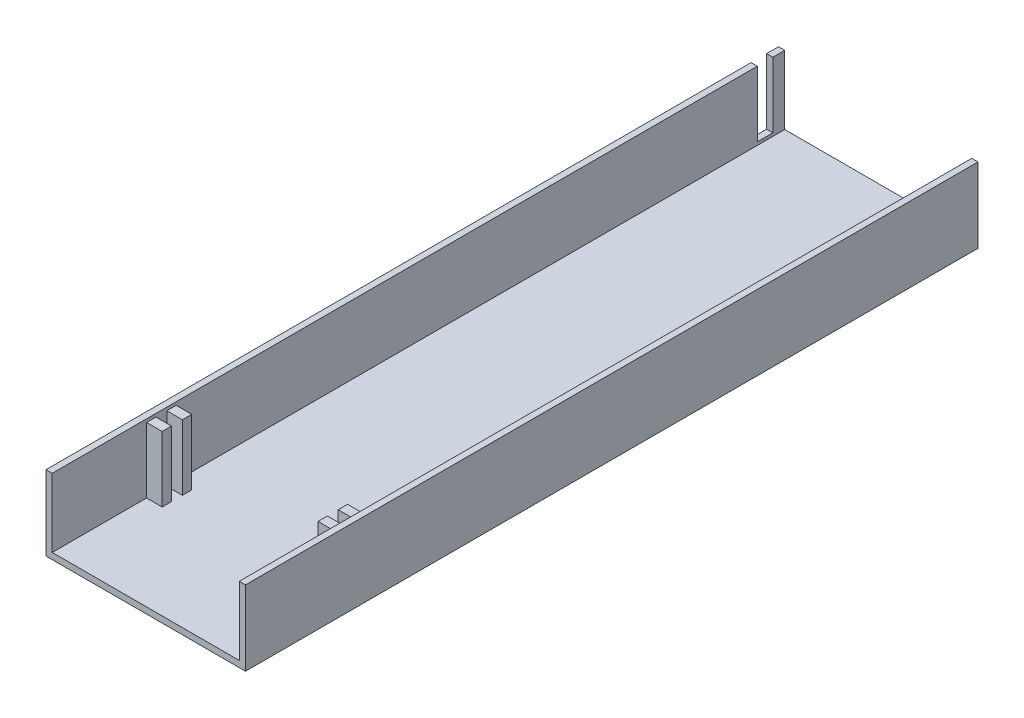
ISO-10303-21;
HEADER;
FILE_DESCRIPTION(('STEP AP214'),'2;1');
FILE_NAME('part.step','',(''),(''),'','','');
FILE_SCHEMA(('AUTOMOTIVE_DESIGN { 1 0 10303 214 1 1 1 1 }'));
ENDSEC;
DATA;
#1=APPLICATION_CONTEXT('core data for automotive mechanical design processes');
#2=APPLICATION_PROTOCOL_DEFINITION('international standard','automotive_design',2000,#1);
#3=PRODUCT_CONTEXT('',#1,'mechanical');
#4=PRODUCT('Part','Part','',(#3));
#5=PRODUCT_RELATED_PRODUCT_CATEGORY('part','',(#4));
#6=PRODUCT_DEFINITION_FORMATION('','',#4);
#7=PRODUCT_DEFINITION_CONTEXT('part definition',#1,'design');
#8=PRODUCT_DEFINITION('design','',#6,#7);
#9=PRODUCT_DEFINITION_SHAPE('','',#8);
#10=(LENGTH_UNIT() NAMED_UNIT(*) SI_UNIT(.MILLI.,.METRE.));
#11=(NAMED_UNIT(*) PLANE_ANGLE_UNIT() SI_UNIT($,.RADIAN.));
#12=(NAMED_UNIT(*) SI_UNIT($,.STERADIAN.) SOLID_ANGLE_UNIT());
#13=UNCERTAINTY_MEASURE_WITH_UNIT(LENGTH_MEASURE(1.E-05),#10,'distance_accuracy_value','');
#14=(GEOMETRIC_REPRESENTATION_CONTEXT(3) GLOBAL_UNCERTAINTY_ASSIGNED_CONTEXT((#13)) GLOBAL_UNIT_ASSIGNED_CONTEXT((#10,
#11,#12)) REPRESENTATION_CONTEXT('',''));
#15=CARTESIAN_POINT('',(0.,0.,0.));
#16=DIRECTION('',(0.,0.,1.));
#17=DIRECTION('',(1.,0.,0.));
#18=AXIS2_PLACEMENT_3D('',#15,#16,#17);
#19=CARTESIAN_POINT('',(-30.,12.,35.));
#20=DIRECTION('',(0.,-1.,0.));
#21=DIRECTION('',(0.,0.,-1.));
#22=AXIS2_PLACEMENT_3D('',#19,#20,#21);
#23=PLANE('',#22);
#24=DIRECTION('',(0.,0.,-1.));
#25=VECTOR('',#24,1.);
#26=CARTESIAN_POINT('',(-30.,12.,35.));
#27=LINE('',#26,#25);
#28=CARTESIAN_POINT('',(-30.,12.,35.));
#29=VERTEX_POINT('',#28);
#30=CARTESIAN_POINT('',(-30.,12.,-191.2));
#31=VERTEX_POINT('',#30);
#32=EDGE_CURVE('E11',#29,#31,#27,.T.);
#33=ORIENTED_EDGE('',*,*,#32,.T.);
#34=DIRECTION('',(-1.,0.,0.));
#35=VECTOR('',#34,1.);
#36=CARTESIAN_POINT('',(-22.,12.,-191.2));
#37=LINE('',#36,#35);
#38=CARTESIAN_POINT('',(-32.,12.,-191.2));
#39=VERTEX_POINT('',#38);
#40=EDGE_CURVE('E243',#31,#39,#37,.T.);
#41=ORIENTED_EDGE('',*,*,#40,.T.);
#42=DIRECTION('',(0.,0.,-1.));
#43=VECTOR('',#42,1.);
#44=CARTESIAN_POINT('',(-32.,12.,35.));
#45=LINE('',#44,#43);
#46=CARTESIAN_POINT('',(-32.,12.,35.));
#47=VERTEX_POINT('',#46);
#48=EDGE_CURVE('E426',#47,#39,#45,.T.);
#49=ORIENTED_EDGE('',*,*,#48,.F.);
#50=DIRECTION('',(-1.,0.,0.));
#51=VECTOR('',#50,1.);
#52=CARTESIAN_POINT('',(-30.,12.,35.));
#53=LINE('',#52,#51);
#54=EDGE_CURVE('E394',#29,#47,#53,.T.);
#55=ORIENTED_EDGE('',*,*,#54,.F.);
#56=EDGE_LOOP('',(#33,#41,#49,#55));
#57=FACE_BOUND('',#56,.T.);
#58=ADVANCED_FACE('F33',(#57),#23,.F.);
#59=CARTESIAN_POINT('',(30.,-9.99999999999999,35.));
#60=DIRECTION('',(0.,-1.,0.));
#61=DIRECTION('',(1.,0.,0.));
#62=AXIS2_PLACEMENT_3D('',#59,#60,#61);
#63=PLANE('',#62);
#64=DIRECTION('',(1.,0.,0.));
#65=VECTOR('',#64,1.);
#66=CARTESIAN_POINT('',(-25.,-10.,4.75));
#67=LINE('',#66,#65);
#68=CARTESIAN_POINT('',(-30.,-10.,4.75));
#69=VERTEX_POINT('',#68);
#70=CARTESIAN_POINT('',(-25.,-10.,4.75));
#71=VERTEX_POINT('',#70);
#72=EDGE_CURVE('E252',#69,#71,#67,.T.);
#73=ORIENTED_EDGE('',*,*,#72,.F.);
#74=DIRECTION('',(0.,0.,-1.));
#75=VECTOR('',#74,1.);
#76=CARTESIAN_POINT('',(-30.,-10.,35.));
#77=LINE('',#76,#75);
#78=CARTESIAN_POINT('',(-30.,-10.,35.));
#79=VERTEX_POINT('',#78);
#80=EDGE_CURVE('E409',#79,#69,#77,.T.);
#81=ORIENTED_EDGE('',*,*,#80,.F.);
#82=DIRECTION('',(-1.,0.,0.));
#83=VECTOR('',#82,1.);
#84=CARTESIAN_POINT('',(30.,-9.99999999999999,35.));
#85=LINE('',#84,#83);
#86=CARTESIAN_POINT('',(30.,-9.99999999999999,35.));
#87=VERTEX_POINT('',#86);
#88=EDGE_CURVE('E406',#87,#79,#85,.T.);
#89=ORIENTED_EDGE('',*,*,#88,.F.);
#90=DIRECTION('',(0.,0.,-1.));
#91=VECTOR('',#90,1.);
#92=CARTESIAN_POINT('',(30.,-9.99999999999999,35.));
#93=LINE('',#92,#91);
#94=CARTESIAN_POINT('',(30.,-9.99999999999999,4.75));
#95=VERTEX_POINT('',#94);
#96=EDGE_CURVE('E414',#87,#95,#93,.T.);
#97=ORIENTED_EDGE('',*,*,#96,.T.);
#98=DIRECTION('',(1.,0.,0.));
#99=VECTOR('',#98,1.);
#100=CARTESIAN_POINT('',(25.,-9.99999999999999,4.75));
#101=LINE('',#100,#99);
#102=CARTESIAN_POINT('',(25.,-9.99999999999999,4.75));
#103=VERTEX_POINT('',#102);
#104=EDGE_CURVE('E314',#103,#95,#101,.T.);
#105=ORIENTED_EDGE('',*,*,#104,.F.);
#106=DIRECTION('',(0.,0.,1.));
#107=VECTOR('',#106,1.);
#108=CARTESIAN_POINT('',(25.,-9.99999999999999,1.75));
#109=LINE('',#108,#107);
#110=CARTESIAN_POINT('',(25.,-9.99999999999999,1.75));
#111=VERTEX_POINT('',#110);
#112=EDGE_CURVE('E324',#111,#103,#109,.T.);
#113=ORIENTED_EDGE('',*,*,#112,.F.);
#114=DIRECTION('',(-1.,0.,0.));
#115=VECTOR('',#114,1.);
#116=CARTESIAN_POINT('',(30.,-9.99999999999999,1.75));
#117=LINE('',#116,#115);
#118=CARTESIAN_POINT('',(30.,-9.99999999999999,1.75));
#119=VERTEX_POINT('',#118);
#120=EDGE_CURVE('E309',#119,#111,#117,.T.);
#121=ORIENTED_EDGE('',*,*,#120,.F.);
#122=CARTESIAN_POINT('',(30.,-9.99999999999999,-1.75));
#123=VERTEX_POINT('',#122);
#124=EDGE_CURVE('E418',#119,#123,#93,.T.);
#125=ORIENTED_EDGE('',*,*,#124,.T.);
#126=DIRECTION('',(1.,0.,0.));
#127=VECTOR('',#126,1.);
#128=CARTESIAN_POINT('',(30.,-9.99999999999999,-1.75));
#129=LINE('',#128,#127);
#130=CARTESIAN_POINT('',(25.,-9.99999999999999,-1.75));
#131=VERTEX_POINT('',#130);
#132=EDGE_CURVE('E284',#131,#123,#129,.T.);
#133=ORIENTED_EDGE('',*,*,#132,.F.);
#134=DIRECTION('',(0.,0.,1.));
#135=VECTOR('',#134,1.);
#136=CARTESIAN_POINT('',(25.,-9.99999999999999,-1.75));
#137=LINE('',#136,#135);
#138=CARTESIAN_POINT('',(25.,-9.99999999999999,-4.75));
#139=VERTEX_POINT('',#138);
#140=EDGE_CURVE('E294',#139,#131,#137,.T.);
#141=ORIENTED_EDGE('',*,*,#140,.F.);
#142=DIRECTION('',(-1.,0.,0.));
#143=VECTOR('',#142,1.);
#144=CARTESIAN_POINT('',(25.,-9.99999999999999,-4.75));
#145=LINE('',#144,#143);
#146=CARTESIAN_POINT('',(30.,-9.99999999999999,-4.75));
#147=VERTEX_POINT('',#146);
#148=EDGE_CURVE('E279',#147,#139,#145,.T.);
#149=ORIENTED_EDGE('',*,*,#148,.F.);
#150=CARTESIAN_POINT('',(30.,-9.99999999999999,-200.));
#151=VERTEX_POINT('',#150);
#152=EDGE_CURVE('E412',#147,#151,#93,.T.);
#153=ORIENTED_EDGE('',*,*,#152,.T.);
#154=DIRECTION('',(1.,0.,0.));
#155=VECTOR('',#154,1.);
#156=CARTESIAN_POINT('',(-30.,-10.,-200.));
#157=LINE('',#156,#155);
#158=CARTESIAN_POINT('',(-30.,-10.,-200.));
#159=VERTEX_POINT('',#158);
#160=EDGE_CURVE('E368',#159,#151,#157,.T.);
#161=ORIENTED_EDGE('',*,*,#160,.F.);
#162=CARTESIAN_POINT('',(-30.,-10.,-4.75));
#163=VERTEX_POINT('',#162);
#164=EDGE_CURVE('E408',#163,#159,#77,.T.);
#165=ORIENTED_EDGE('',*,*,#164,.F.);
#166=DIRECTION('',(-1.,0.,0.));
#167=VECTOR('',#166,1.);
#168=CARTESIAN_POINT('',(-25.,-10.,-4.75));
#169=LINE('',#168,#167);
#170=CARTESIAN_POINT('',(-25.,-10.,-4.75));
#171=VERTEX_POINT('',#170);
#172=EDGE_CURVE('E341',#171,#163,#169,.T.);
#173=ORIENTED_EDGE('',*,*,#172,.F.);
#174=DIRECTION('',(0.,0.,-1.));
#175=VECTOR('',#174,1.);
#176=CARTESIAN_POINT('',(-25.,-10.,-1.75));
#177=LINE('',#176,#175);
#178=CARTESIAN_POINT('',(-25.,-10.,-1.75));
#179=VERTEX_POINT('',#178);
#180=EDGE_CURVE('E352',#179,#171,#177,.T.);
#181=ORIENTED_EDGE('',*,*,#180,.F.);
#182=DIRECTION('',(1.,0.,0.));
#183=VECTOR('',#182,1.);
#184=CARTESIAN_POINT('',(-30.,-10.,-1.75));
#185=LINE('',#184,#183);
#186=CARTESIAN_POINT('',(-30.,-10.,-1.75));
#187=VERTEX_POINT('',#186);
#188=EDGE_CURVE('E336',#187,#179,#185,.T.);
#189=ORIENTED_EDGE('',*,*,#188,.F.);
#190=CARTESIAN_POINT('',(-30.,-10.,1.75));
#191=VERTEX_POINT('',#190);
#192=EDGE_CURVE('E413',#191,#187,#77,.T.);
#193=ORIENTED_EDGE('',*,*,#192,.F.);
#194=DIRECTION('',(-1.,0.,0.));
#195=VECTOR('',#194,1.);
#196=CARTESIAN_POINT('',(-30.,-10.,1.75));
#197=LINE('',#196,#195);
#198=CARTESIAN_POINT('',(-25.,-10.,1.75));
#199=VERTEX_POINT('',#198);
#200=EDGE_CURVE('E257',#199,#191,#197,.T.);
#201=ORIENTED_EDGE('',*,*,#200,.F.);
#202=DIRECTION('',(0.,0.,-1.));
#203=VECTOR('',#202,1.);
#204=CARTESIAN_POINT('',(-25.,-10.,1.75));
#205=LINE('',#204,#203);
#206=EDGE_CURVE('E56',#71,#199,#205,.T.);
#207=ORIENTED_EDGE('',*,*,#206,.F.);
#208=EDGE_LOOP('',(#73,#81,#89,#97,#105,#113,#121,#125,#133,#141,#149,#153,#161,#165,#173,#181,
#189,#193,#201,#207));
#209=FACE_BOUND('',#208,.T.);
#210=ADVANCED_FACE('F441',(#209),#63,.F.);
#211=CARTESIAN_POINT('',(-30.,12.,35.));
#212=DIRECTION('',(-1.,0.,0.));
#213=DIRECTION('',(0.,-1.,0.));
#214=AXIS2_PLACEMENT_3D('',#211,#212,#213);
#215=PLANE('',#214);
#216=DIRECTION('',(0.,0.,1.));
#217=VECTOR('',#216,1.);
#218=CARTESIAN_POINT('',(-30.,-9.,35.));
#219=LINE('',#218,#217);
#220=CARTESIAN_POINT('',(-30.,-9.,-196.2));
#221=VERTEX_POINT('',#220);
#222=CARTESIAN_POINT('',(-30.,-9.,-191.2));
#223=VERTEX_POINT('',#222);
#224=EDGE_CURVE('E226',#221,#223,#219,.T.);
#225=ORIENTED_EDGE('',*,*,#224,.T.);
#226=DIRECTION('',(0.,1.,0.));
#227=VECTOR('',#226,1.);
#228=CARTESIAN_POINT('',(-30.,12.,-191.2));
#229=LINE('',#228,#227);
#230=EDGE_CURVE('E249',#223,#31,#229,.T.);
#231=ORIENTED_EDGE('',*,*,#230,.T.);
#232=ORIENTED_EDGE('',*,*,#32,.F.);
#233=DIRECTION('',(0.,1.,0.));
#234=VECTOR('',#233,1.);
#235=CARTESIAN_POINT('',(-30.,-10.,35.));
#236=LINE('',#235,#234);
#237=EDGE_CURVE('E392',#79,#29,#236,.T.);
#238=ORIENTED_EDGE('',*,*,#237,.F.);
#239=ORIENTED_EDGE('',*,*,#80,.T.);
#240=DIRECTION('',(0.,-1.,0.));
#241=VECTOR('',#240,1.);
#242=CARTESIAN_POINT('',(-30.,11.,4.75));
#243=LINE('',#242,#241);
#244=CARTESIAN_POINT('',(-30.,11.,4.75));
#245=VERTEX_POINT('',#244);
#246=EDGE_CURVE('E276',#245,#69,#243,.T.);
#247=ORIENTED_EDGE('',*,*,#246,.F.);
#248=DIRECTION('',(0.,0.,1.));
#249=VECTOR('',#248,1.);
#250=CARTESIAN_POINT('',(-30.,11.,4.75));
#251=LINE('',#250,#249);
#252=CARTESIAN_POINT('',(-30.,11.,1.75));
#253=VERTEX_POINT('',#252);
#254=EDGE_CURVE('E253',#253,#245,#251,.T.);
#255=ORIENTED_EDGE('',*,*,#254,.F.);
#256=DIRECTION('',(0.,-1.,0.));
#257=VECTOR('',#256,1.);
#258=CARTESIAN_POINT('',(-30.,11.,1.75));
#259=LINE('',#258,#257);
#260=EDGE_CURVE('E264',#253,#191,#259,.T.);
#261=ORIENTED_EDGE('',*,*,#260,.T.);
#262=ORIENTED_EDGE('',*,*,#192,.T.);
#263=DIRECTION('',(0.,-1.,0.));
#264=VECTOR('',#263,1.);
#265=CARTESIAN_POINT('',(-30.,11.,-1.75));
#266=LINE('',#265,#264);
#267=CARTESIAN_POINT('',(-30.,11.,-1.75));
#268=VERTEX_POINT('',#267);
#269=EDGE_CURVE('E349',#268,#187,#266,.T.);
#270=ORIENTED_EDGE('',*,*,#269,.F.);
#271=DIRECTION('',(0.,0.,1.));
#272=VECTOR('',#271,1.);
#273=CARTESIAN_POINT('',(-30.,11.,-4.75));
#274=LINE('',#273,#272);
#275=CARTESIAN_POINT('',(-30.,11.,-4.75));
#276=VERTEX_POINT('',#275);
#277=EDGE_CURVE('E346',#276,#268,#274,.T.);
#278=ORIENTED_EDGE('',*,*,#277,.F.);
#279=DIRECTION('',(0.,-1.,0.));
#280=VECTOR('',#279,1.);
#281=CARTESIAN_POINT('',(-30.,11.,-4.75));
#282=LINE('',#281,#280);
#283=EDGE_CURVE('E359',#276,#163,#282,.T.);
#284=ORIENTED_EDGE('',*,*,#283,.T.);
#285=ORIENTED_EDGE('',*,*,#164,.T.);
#286=DIRECTION('',(0.,-1.,0.));
#287=VECTOR('',#286,1.);
#288=CARTESIAN_POINT('',(-30.,12.,-200.));
#289=LINE('',#288,#287);
#290=CARTESIAN_POINT('',(-30.,12.,-200.));
#291=VERTEX_POINT('',#290);
#292=EDGE_CURVE('E389',#291,#159,#289,.T.);
#293=ORIENTED_EDGE('',*,*,#292,.F.);
#294=CARTESIAN_POINT('',(-30.,12.,-196.2));
#295=VERTEX_POINT('',#294);
#296=EDGE_CURVE('E41',#295,#291,#27,.T.);
#297=ORIENTED_EDGE('',*,*,#296,.F.);
#298=DIRECTION('',(0.,-1.,0.));
#299=VECTOR('',#298,1.);
#300=CARTESIAN_POINT('',(-30.,12.,-196.2));
#301=LINE('',#300,#299);
#302=EDGE_CURVE('E242',#295,#221,#301,.T.);
#303=ORIENTED_EDGE('',*,*,#302,.T.);
#304=EDGE_LOOP('',(#225,#231,#232,#238,#239,#247,#255,#261,#262,#270,#278,#284,#285,#293,#297,#303));
#305=FACE_BOUND('',#304,.T.);
#306=ADVANCED_FACE('F35',(#305),#215,.F.);
#307=CARTESIAN_POINT('',(30.,-9.99999999999999,35.));
#308=DIRECTION('',(1.,0.,0.));
#309=DIRECTION('',(0.,0.,-1.));
#310=AXIS2_PLACEMENT_3D('',#307,#308,#309);
#311=PLANE('',#310);
#312=DIRECTION('',(0.,-1.,0.));
#313=VECTOR('',#312,1.);
#314=CARTESIAN_POINT('',(30.,11.,-4.75));
#315=LINE('',#314,#313);
#316=CARTESIAN_POINT('',(30.,11.,-4.75));
#317=VERTEX_POINT('',#316);
#318=EDGE_CURVE('E306',#317,#147,#315,.T.);
#319=ORIENTED_EDGE('',*,*,#318,.F.);
#320=DIRECTION('',(0.,0.,-1.));
#321=VECTOR('',#320,1.);
#322=CARTESIAN_POINT('',(30.,11.,-4.75));
#323=LINE('',#322,#321);
#324=CARTESIAN_POINT('',(30.,11.,-1.75));
#325=VERTEX_POINT('',#324);
#326=EDGE_CURVE('E280',#325,#317,#323,.T.);
#327=ORIENTED_EDGE('',*,*,#326,.F.);
#328=DIRECTION('',(0.,-1.,0.));
#329=VECTOR('',#328,1.);
#330=CARTESIAN_POINT('',(30.,11.,-1.75));
#331=LINE('',#330,#329);
#332=EDGE_CURVE('E291',#325,#123,#331,.T.);
#333=ORIENTED_EDGE('',*,*,#332,.T.);
#334=ORIENTED_EDGE('',*,*,#124,.F.);
#335=DIRECTION('',(0.,-1.,0.));
#336=VECTOR('',#335,1.);
#337=CARTESIAN_POINT('',(30.,11.,1.75));
#338=LINE('',#337,#336);
#339=CARTESIAN_POINT('',(30.,11.,1.75));
#340=VERTEX_POINT('',#339);
#341=EDGE_CURVE('E321',#340,#119,#338,.T.);
#342=ORIENTED_EDGE('',*,*,#341,.F.);
#343=DIRECTION('',(0.,0.,-1.));
#344=VECTOR('',#343,1.);
#345=CARTESIAN_POINT('',(30.,11.,4.75));
#346=LINE('',#345,#344);
#347=CARTESIAN_POINT('',(30.,11.,4.75));
#348=VERTEX_POINT('',#347);
#349=EDGE_CURVE('E319',#348,#340,#346,.T.);
#350=ORIENTED_EDGE('',*,*,#349,.F.);
#351=DIRECTION('',(0.,-1.,0.));
#352=VECTOR('',#351,1.);
#353=CARTESIAN_POINT('',(30.,11.,4.75));
#354=LINE('',#353,#352);
#355=EDGE_CURVE('E328',#348,#95,#354,.T.);
#356=ORIENTED_EDGE('',*,*,#355,.T.);
#357=ORIENTED_EDGE('',*,*,#96,.F.);
#358=DIRECTION('',(0.,-1.,0.));
#359=VECTOR('',#358,1.);
#360=CARTESIAN_POINT('',(30.,10.,35.));
#361=LINE('',#360,#359);
#362=CARTESIAN_POINT('',(30.,12.,35.));
#363=VERTEX_POINT('',#362);
#364=EDGE_CURVE('E404',#363,#87,#361,.T.);
#365=ORIENTED_EDGE('',*,*,#364,.F.);
#366=DIRECTION('',(0.,0.,-1.));
#367=VECTOR('',#366,1.);
#368=CARTESIAN_POINT('',(30.,12.,35.));
#369=LINE('',#368,#367);
#370=CARTESIAN_POINT('',(30.,12.,-200.));
#371=VERTEX_POINT('',#370);
#372=EDGE_CURVE('E417',#363,#371,#369,.T.);
#373=ORIENTED_EDGE('',*,*,#372,.T.);
#374=DIRECTION('',(0.,1.,0.));
#375=VECTOR('',#374,1.);
#376=CARTESIAN_POINT('',(30.,-9.99999999999999,-200.));
#377=LINE('',#376,#375);
#378=EDGE_CURVE('E371',#151,#371,#377,.T.);
#379=ORIENTED_EDGE('',*,*,#378,.F.);
#380=ORIENTED_EDGE('',*,*,#152,.F.);
#381=EDGE_LOOP('',(#319,#327,#333,#334,#342,#350,#356,#357,#365,#373,#379,#380));
#382=FACE_BOUND('',#381,.T.);
#383=ADVANCED_FACE('F445',(#382),#311,.F.);
#384=CARTESIAN_POINT('',(-32.,12.,-196.2));
#385=VERTEX_POINT('',#384);
#386=CARTESIAN_POINT('',(-32.,12.,-200.));
#387=VERTEX_POINT('',#386);
#388=EDGE_CURVE('E425',#385,#387,#45,.T.);
#389=ORIENTED_EDGE('',*,*,#388,.F.);
#390=DIRECTION('',(-1.,0.,0.));
#391=VECTOR('',#390,1.);
#392=CARTESIAN_POINT('',(-22.,12.,-196.2));
#393=LINE('',#392,#391);
#394=EDGE_CURVE('E48',#295,#385,#393,.T.);
#395=ORIENTED_EDGE('',*,*,#394,.F.);
#396=ORIENTED_EDGE('',*,*,#296,.T.);
#397=DIRECTION('',(1.,0.,0.));
#398=VECTOR('',#397,1.);
#399=CARTESIAN_POINT('',(-32.,12.,-200.));
#400=LINE('',#399,#398);
#401=EDGE_CURVE('E386',#387,#291,#400,.T.);
#402=ORIENTED_EDGE('',*,*,#401,.F.);
#403=EDGE_LOOP('',(#389,#395,#396,#402));
#404=FACE_BOUND('',#403,.T.);
#405=ADVANCED_FACE('F437',(#404),#23,.F.);
#406=CARTESIAN_POINT('',(-32.,-12.,35.));
#407=DIRECTION('',(1.,0.,0.));
#408=DIRECTION('',(0.,0.,-1.));
#409=AXIS2_PLACEMENT_3D('',#406,#407,#408);
#410=PLANE('',#409);
#411=ORIENTED_EDGE('',*,*,#48,.T.);
#412=DIRECTION('',(0.,1.,0.));
#413=VECTOR('',#412,1.);
#414=CARTESIAN_POINT('',(-32.,12.,-191.2));
#415=LINE('',#414,#413);
#416=CARTESIAN_POINT('',(-32.,-9.,-191.2));
#417=VERTEX_POINT('',#416);
#418=EDGE_CURVE('E229',#417,#39,#415,.T.);
#419=ORIENTED_EDGE('',*,*,#418,.F.);
#420=DIRECTION('',(0.,0.,1.));
#421=VECTOR('',#420,1.);
#422=CARTESIAN_POINT('',(-32.,-9.,-196.2));
#423=LINE('',#422,#421);
#424=CARTESIAN_POINT('',(-32.,-9.,-196.2));
#425=VERTEX_POINT('',#424);
#426=EDGE_CURVE('E223',#425,#417,#423,.T.);
#427=ORIENTED_EDGE('',*,*,#426,.F.);
#428=DIRECTION('',(0.,-1.,0.));
#429=VECTOR('',#428,1.);
#430=CARTESIAN_POINT('',(-32.,9.,-196.2));
#431=LINE('',#430,#429);
#432=EDGE_CURVE('E231',#385,#425,#431,.T.);
#433=ORIENTED_EDGE('',*,*,#432,.F.);
#434=ORIENTED_EDGE('',*,*,#388,.T.);
#435=DIRECTION('',(0.,1.,0.));
#436=VECTOR('',#435,1.);
#437=CARTESIAN_POINT('',(-32.,-12.,-200.));
#438=LINE('',#437,#436);
#439=CARTESIAN_POINT('',(-32.,-12.,-200.));
#440=VERTEX_POINT('',#439);
#441=EDGE_CURVE('E383',#440,#387,#438,.T.);
#442=ORIENTED_EDGE('',*,*,#441,.F.);
#443=DIRECTION('',(0.,0.,-1.));
#444=VECTOR('',#443,1.);
#445=CARTESIAN_POINT('',(-32.,-12.,35.));
#446=LINE('',#445,#444);
#447=CARTESIAN_POINT('',(-32.,-12.,35.));
#448=VERTEX_POINT('',#447);
#449=EDGE_CURVE('E424',#448,#440,#446,.T.);
#450=ORIENTED_EDGE('',*,*,#449,.F.);
#451=DIRECTION('',(0.,-1.,0.));
#452=VECTOR('',#451,1.);
#453=CARTESIAN_POINT('',(-32.,-12.,35.));
#454=LINE('',#453,#452);
#455=EDGE_CURVE('E396',#47,#448,#454,.T.);
#456=ORIENTED_EDGE('',*,*,#455,.F.);
#457=EDGE_LOOP('',(#411,#419,#427,#433,#434,#442,#450,#456));
#458=FACE_BOUND('',#457,.T.);
#459=ADVANCED_FACE('F237',(#458),#410,.F.);
#460=CARTESIAN_POINT('',(32.,-12.,35.));
#461=DIRECTION('',(0.,1.,0.));
#462=DIRECTION('',(0.,0.,1.));
#463=AXIS2_PLACEMENT_3D('',#460,#461,#462);
#464=PLANE('',#463);
#465=ORIENTED_EDGE('',*,*,#449,.T.);
#466=DIRECTION('',(-1.,0.,0.));
#467=VECTOR('',#466,1.);
#468=CARTESIAN_POINT('',(32.,-12.,-200.));
#469=LINE('',#468,#467);
#470=CARTESIAN_POINT('',(32.,-12.,-200.));
#471=VERTEX_POINT('',#470);
#472=EDGE_CURVE('E380',#471,#440,#469,.T.);
#473=ORIENTED_EDGE('',*,*,#472,.F.);
#474=DIRECTION('',(0.,0.,-1.));
#475=VECTOR('',#474,1.);
#476=CARTESIAN_POINT('',(32.,-12.,35.));
#477=LINE('',#476,#475);
#478=CARTESIAN_POINT('',(32.,-12.,35.));
#479=VERTEX_POINT('',#478);
#480=EDGE_CURVE('E422',#479,#471,#477,.T.);
#481=ORIENTED_EDGE('',*,*,#480,.F.);
#482=DIRECTION('',(1.,0.,0.));
#483=VECTOR('',#482,1.);
#484=CARTESIAN_POINT('',(32.,-12.,35.));
#485=LINE('',#484,#483);
#486=EDGE_CURVE('E398',#448,#479,#485,.T.);
#487=ORIENTED_EDGE('',*,*,#486,.F.);
#488=EDGE_LOOP('',(#465,#473,#481,#487));
#489=FACE_BOUND('',#488,.T.);
#490=ADVANCED_FACE('F459',(#489),#464,.F.);
#491=CARTESIAN_POINT('',(32.,-12.,35.));
#492=DIRECTION('',(-1.,0.,0.));
#493=DIRECTION('',(0.,0.,1.));
#494=AXIS2_PLACEMENT_3D('',#491,#492,#493);
#495=PLANE('',#494);
#496=ORIENTED_EDGE('',*,*,#480,.T.);
#497=DIRECTION('',(0.,-1.,0.));
#498=VECTOR('',#497,1.);
#499=CARTESIAN_POINT('',(32.,12.,-200.));
#500=LINE('',#499,#498);
#501=CARTESIAN_POINT('',(32.,12.,-200.));
#502=VERTEX_POINT('',#501);
#503=EDGE_CURVE('E377',#502,#471,#500,.T.);
#504=ORIENTED_EDGE('',*,*,#503,.F.);
#505=DIRECTION('',(0.,0.,-1.));
#506=VECTOR('',#505,1.);
#507=CARTESIAN_POINT('',(32.,12.,35.));
#508=LINE('',#507,#506);
#509=CARTESIAN_POINT('',(32.,12.,35.));
#510=VERTEX_POINT('',#509);
#511=EDGE_CURVE('E420',#510,#502,#508,.T.);
#512=ORIENTED_EDGE('',*,*,#511,.F.);
#513=DIRECTION('',(0.,1.,0.));
#514=VECTOR('',#513,1.);
#515=CARTESIAN_POINT('',(32.,-12.,35.));
#516=LINE('',#515,#514);
#517=EDGE_CURVE('E400',#479,#510,#516,.T.);
#518=ORIENTED_EDGE('',*,*,#517,.F.);
#519=EDGE_LOOP('',(#496,#504,#512,#518));
#520=FACE_BOUND('',#519,.T.);
#521=ADVANCED_FACE('F456',(#520),#495,.F.);
#522=CARTESIAN_POINT('',(32.,12.,35.));
#523=DIRECTION('',(0.,-1.,0.));
#524=DIRECTION('',(0.,0.,-1.));
#525=AXIS2_PLACEMENT_3D('',#522,#523,#524);
#526=PLANE('',#525);
#527=ORIENTED_EDGE('',*,*,#511,.T.);
#528=DIRECTION('',(1.,0.,0.));
#529=VECTOR('',#528,1.);
#530=CARTESIAN_POINT('',(30.,12.,-200.));
#531=LINE('',#530,#529);
#532=EDGE_CURVE('E374',#371,#502,#531,.T.);
#533=ORIENTED_EDGE('',*,*,#532,.F.);
#534=ORIENTED_EDGE('',*,*,#372,.F.);
#535=DIRECTION('',(-1.,0.,0.));
#536=VECTOR('',#535,1.);
#537=CARTESIAN_POINT('',(32.,12.,35.));
#538=LINE('',#537,#536);
#539=EDGE_CURVE('E402',#510,#363,#538,.T.);
#540=ORIENTED_EDGE('',*,*,#539,.F.);
#541=EDGE_LOOP('',(#527,#533,#534,#540));
#542=FACE_BOUND('',#541,.T.);
#543=ADVANCED_FACE('F451',(#542),#526,.F.);
#544=CARTESIAN_POINT('',(0.,0.,35.));
#545=DIRECTION('',(0.,0.,1.));
#546=DIRECTION('',(1.,0.,0.));
#547=AXIS2_PLACEMENT_3D('',#544,#545,#546);
#548=PLANE('',#547);
#549=ORIENTED_EDGE('',*,*,#237,.T.);
#550=ORIENTED_EDGE('',*,*,#54,.T.);
#551=ORIENTED_EDGE('',*,*,#455,.T.);
#552=ORIENTED_EDGE('',*,*,#486,.T.);
#553=ORIENTED_EDGE('',*,*,#517,.T.);
#554=ORIENTED_EDGE('',*,*,#539,.T.);
#555=ORIENTED_EDGE('',*,*,#364,.T.);
#556=ORIENTED_EDGE('',*,*,#88,.T.);
#557=EDGE_LOOP('',(#549,#550,#551,#552,#553,#554,#555,#556));
#558=FACE_BOUND('',#557,.T.);
#559=ADVANCED_FACE('F462',(#558),#548,.T.);
#560=CARTESIAN_POINT('',(0.,0.,-200.));
#561=DIRECTION('',(0.,0.,1.));
#562=DIRECTION('',(1.,0.,0.));
#563=AXIS2_PLACEMENT_3D('',#560,#561,#562);
#564=PLANE('',#563);
#565=ORIENTED_EDGE('',*,*,#160,.T.);
#566=ORIENTED_EDGE('',*,*,#378,.T.);
#567=ORIENTED_EDGE('',*,*,#532,.T.);
#568=ORIENTED_EDGE('',*,*,#503,.T.);
#569=ORIENTED_EDGE('',*,*,#472,.T.);
#570=ORIENTED_EDGE('',*,*,#441,.T.);
#571=ORIENTED_EDGE('',*,*,#401,.T.);
#572=ORIENTED_EDGE('',*,*,#292,.T.);
#573=EDGE_LOOP('',(#565,#566,#567,#568,#569,#570,#571,#572));
#574=FACE_BOUND('',#573,.T.);
#575=ADVANCED_FACE('F434',(#574),#564,.F.);
#576=CARTESIAN_POINT('',(-30.,11.,-1.75));
#577=DIRECTION('',(0.,0.,-1.));
#578=DIRECTION('',(-1.,0.,0.));
#579=AXIS2_PLACEMENT_3D('',#576,#577,#578);
#580=PLANE('',#579);
#581=ORIENTED_EDGE('',*,*,#188,.T.);
#582=DIRECTION('',(0.,-1.,0.));
#583=VECTOR('',#582,1.);
#584=CARTESIAN_POINT('',(-25.,11.,-1.75));
#585=LINE('',#584,#583);
#586=CARTESIAN_POINT('',(-25.,11.,-1.75));
#587=VERTEX_POINT('',#586);
#588=EDGE_CURVE('E365',#587,#179,#585,.T.);
#589=ORIENTED_EDGE('',*,*,#588,.F.);
#590=DIRECTION('',(1.,0.,0.));
#591=VECTOR('',#590,1.);
#592=CARTESIAN_POINT('',(-30.,11.,-1.75));
#593=LINE('',#592,#591);
#594=EDGE_CURVE('E337',#268,#587,#593,.T.);
#595=ORIENTED_EDGE('',*,*,#594,.F.);
#596=ORIENTED_EDGE('',*,*,#269,.T.);
#597=EDGE_LOOP('',(#581,#589,#595,#596));
#598=FACE_BOUND('',#597,.T.);
#599=ADVANCED_FACE('F541',(#598),#580,.F.);
#600=CARTESIAN_POINT('',(-25.,11.,-1.75));
#601=DIRECTION('',(-1.,0.,0.));
#602=DIRECTION('',(0.,0.,1.));
#603=AXIS2_PLACEMENT_3D('',#600,#601,#602);
#604=PLANE('',#603);
#605=ORIENTED_EDGE('',*,*,#180,.T.);
#606=DIRECTION('',(0.,-1.,0.));
#607=VECTOR('',#606,1.);
#608=CARTESIAN_POINT('',(-25.,11.,-4.75));
#609=LINE('',#608,#607);
#610=CARTESIAN_POINT('',(-25.,11.,-4.75));
#611=VERTEX_POINT('',#610);
#612=EDGE_CURVE('E362',#611,#171,#609,.T.);
#613=ORIENTED_EDGE('',*,*,#612,.F.);
#614=DIRECTION('',(0.,0.,-1.));
#615=VECTOR('',#614,1.);
#616=CARTESIAN_POINT('',(-25.,11.,-1.75));
#617=LINE('',#616,#615);
#618=EDGE_CURVE('E340',#587,#611,#617,.T.);
#619=ORIENTED_EDGE('',*,*,#618,.F.);
#620=ORIENTED_EDGE('',*,*,#588,.T.);
#621=EDGE_LOOP('',(#605,#613,#619,#620));
#622=FACE_BOUND('',#621,.T.);
#623=ADVANCED_FACE('F549',(#622),#604,.F.);
#624=CARTESIAN_POINT('',(-25.,11.,-4.75));
#625=DIRECTION('',(0.,0.,1.));
#626=DIRECTION('',(1.,0.,0.));
#627=AXIS2_PLACEMENT_3D('',#624,#625,#626);
#628=PLANE('',#627);
#629=ORIENTED_EDGE('',*,*,#172,.T.);
#630=ORIENTED_EDGE('',*,*,#283,.F.);
#631=DIRECTION('',(-1.,0.,0.));
#632=VECTOR('',#631,1.);
#633=CARTESIAN_POINT('',(-25.,11.,-4.75));
#634=LINE('',#633,#632);
#635=EDGE_CURVE('E343',#611,#276,#634,.T.);
#636=ORIENTED_EDGE('',*,*,#635,.F.);
#637=ORIENTED_EDGE('',*,*,#612,.T.);
#638=EDGE_LOOP('',(#629,#630,#636,#637));
#639=FACE_BOUND('',#638,.T.);
#640=ADVANCED_FACE('F557',(#639),#628,.F.);
#641=CARTESIAN_POINT('',(0.,11.,0.));
#642=DIRECTION('',(0.,1.,0.));
#643=DIRECTION('',(0.,0.,1.));
#644=AXIS2_PLACEMENT_3D('',#641,#642,#643);
#645=PLANE('',#644);
#646=ORIENTED_EDGE('',*,*,#594,.T.);
#647=ORIENTED_EDGE('',*,*,#618,.T.);
#648=ORIENTED_EDGE('',*,*,#635,.T.);
#649=ORIENTED_EDGE('',*,*,#277,.T.);
#650=EDGE_LOOP('',(#646,#647,#648,#649));
#651=FACE_BOUND('',#650,.T.);
#652=ADVANCED_FACE('F565',(#651),#645,.T.);
#653=CARTESIAN_POINT('',(30.,11.,1.75));
#654=DIRECTION('',(0.,0.,1.));
#655=DIRECTION('',(1.,0.,0.));
#656=AXIS2_PLACEMENT_3D('',#653,#654,#655);
#657=PLANE('',#656);
#658=ORIENTED_EDGE('',*,*,#120,.T.);
#659=DIRECTION('',(0.,-1.,0.));
#660=VECTOR('',#659,1.);
#661=CARTESIAN_POINT('',(25.,11.,1.75));
#662=LINE('',#661,#660);
#663=CARTESIAN_POINT('',(25.,11.,1.75));
#664=VERTEX_POINT('',#663);
#665=EDGE_CURVE('E334',#664,#111,#662,.T.);
#666=ORIENTED_EDGE('',*,*,#665,.F.);
#667=DIRECTION('',(-1.,0.,0.));
#668=VECTOR('',#667,1.);
#669=CARTESIAN_POINT('',(30.,11.,1.75));
#670=LINE('',#669,#668);
#671=EDGE_CURVE('E310',#340,#664,#670,.T.);
#672=ORIENTED_EDGE('',*,*,#671,.F.);
#673=ORIENTED_EDGE('',*,*,#341,.T.);
#674=EDGE_LOOP('',(#658,#666,#672,#673));
#675=FACE_BOUND('',#674,.T.);
#676=ADVANCED_FACE('F573',(#675),#657,.F.);
#677=CARTESIAN_POINT('',(25.,11.,1.75));
#678=DIRECTION('',(1.,0.,0.));
#679=DIRECTION('',(0.,0.,-1.));
#680=AXIS2_PLACEMENT_3D('',#677,#678,#679);
#681=PLANE('',#680);
#682=ORIENTED_EDGE('',*,*,#112,.T.);
#683=DIRECTION('',(0.,-1.,0.));
#684=VECTOR('',#683,1.);
#685=CARTESIAN_POINT('',(25.,11.,4.75));
#686=LINE('',#685,#684);
#687=CARTESIAN_POINT('',(25.,11.,4.75));
#688=VERTEX_POINT('',#687);
#689=EDGE_CURVE('E331',#688,#103,#686,.T.);
#690=ORIENTED_EDGE('',*,*,#689,.F.);
#691=DIRECTION('',(0.,0.,1.));
#692=VECTOR('',#691,1.);
#693=CARTESIAN_POINT('',(25.,11.,1.75));
#694=LINE('',#693,#692);
#695=EDGE_CURVE('E313',#664,#688,#694,.T.);
#696=ORIENTED_EDGE('',*,*,#695,.F.);
#697=ORIENTED_EDGE('',*,*,#665,.T.);
#698=EDGE_LOOP('',(#682,#690,#696,#697));
#699=FACE_BOUND('',#698,.T.);
#700=ADVANCED_FACE('F581',(#699),#681,.F.);
#701=CARTESIAN_POINT('',(25.,11.,4.75));
#702=DIRECTION('',(0.,0.,-1.));
#703=DIRECTION('',(-1.,0.,0.));
#704=AXIS2_PLACEMENT_3D('',#701,#702,#703);
#705=PLANE('',#704);
#706=ORIENTED_EDGE('',*,*,#104,.T.);
#707=ORIENTED_EDGE('',*,*,#355,.F.);
#708=DIRECTION('',(1.,0.,0.));
#709=VECTOR('',#708,1.);
#710=CARTESIAN_POINT('',(25.,11.,4.75));
#711=LINE('',#710,#709);
#712=EDGE_CURVE('E316',#688,#348,#711,.T.);
#713=ORIENTED_EDGE('',*,*,#712,.F.);
#714=ORIENTED_EDGE('',*,*,#689,.T.);
#715=EDGE_LOOP('',(#706,#707,#713,#714));
#716=FACE_BOUND('',#715,.T.);
#717=ADVANCED_FACE('F589',(#716),#705,.F.);
#718=CARTESIAN_POINT('',(0.,11.,0.));
#719=DIRECTION('',(0.,1.,0.));
#720=DIRECTION('',(0.,0.,1.));
#721=AXIS2_PLACEMENT_3D('',#718,#719,#720);
#722=PLANE('',#721);
#723=ORIENTED_EDGE('',*,*,#671,.T.);
#724=ORIENTED_EDGE('',*,*,#695,.T.);
#725=ORIENTED_EDGE('',*,*,#712,.T.);
#726=ORIENTED_EDGE('',*,*,#349,.T.);
#727=EDGE_LOOP('',(#723,#724,#725,#726));
#728=FACE_BOUND('',#727,.T.);
#729=ADVANCED_FACE('F597',(#728),#722,.T.);
#730=CARTESIAN_POINT('',(25.,11.,-4.75));
#731=DIRECTION('',(0.,0.,1.));
#732=DIRECTION('',(1.,0.,0.));
#733=AXIS2_PLACEMENT_3D('',#730,#731,#732);
#734=PLANE('',#733);
#735=ORIENTED_EDGE('',*,*,#148,.T.);
#736=DIRECTION('',(0.,-1.,0.));
#737=VECTOR('',#736,1.);
#738=CARTESIAN_POINT('',(25.,11.,-4.75));
#739=LINE('',#738,#737);
#740=CARTESIAN_POINT('',(25.,11.,-4.75));
#741=VERTEX_POINT('',#740);
#742=EDGE_CURVE('E303',#741,#139,#739,.T.);
#743=ORIENTED_EDGE('',*,*,#742,.F.);
#744=DIRECTION('',(-1.,0.,0.));
#745=VECTOR('',#744,1.);
#746=CARTESIAN_POINT('',(25.,11.,-4.75));
#747=LINE('',#746,#745);
#748=EDGE_CURVE('E283',#317,#741,#747,.T.);
#749=ORIENTED_EDGE('',*,*,#748,.F.);
#750=ORIENTED_EDGE('',*,*,#318,.T.);
#751=EDGE_LOOP('',(#735,#743,#749,#750));
#752=FACE_BOUND('',#751,.T.);
#753=ADVANCED_FACE('F605',(#752),#734,.F.);
#754=CARTESIAN_POINT('',(25.,11.,-1.75));
#755=DIRECTION('',(1.,0.,0.));
#756=DIRECTION('',(0.,0.,-1.));
#757=AXIS2_PLACEMENT_3D('',#754,#755,#756);
#758=PLANE('',#757);
#759=ORIENTED_EDGE('',*,*,#140,.T.);
#760=DIRECTION('',(0.,-1.,0.));
#761=VECTOR('',#760,1.);
#762=CARTESIAN_POINT('',(25.,11.,-1.75));
#763=LINE('',#762,#761);
#764=CARTESIAN_POINT('',(25.,11.,-1.75));
#765=VERTEX_POINT('',#764);
#766=EDGE_CURVE('E300',#765,#131,#763,.T.);
#767=ORIENTED_EDGE('',*,*,#766,.F.);
#768=DIRECTION('',(0.,0.,1.));
#769=VECTOR('',#768,1.);
#770=CARTESIAN_POINT('',(25.,11.,-1.75));
#771=LINE('',#770,#769);
#772=EDGE_CURVE('E286',#741,#765,#771,.T.);
#773=ORIENTED_EDGE('',*,*,#772,.F.);
#774=ORIENTED_EDGE('',*,*,#742,.T.);
#775=EDGE_LOOP('',(#759,#767,#773,#774));
#776=FACE_BOUND('',#775,.T.);
#777=ADVANCED_FACE('F613',(#776),#758,.F.);
#778=CARTESIAN_POINT('',(30.,11.,-1.75));
#779=DIRECTION('',(0.,0.,-1.));
#780=DIRECTION('',(-1.,0.,0.));
#781=AXIS2_PLACEMENT_3D('',#778,#779,#780);
#782=PLANE('',#781);
#783=ORIENTED_EDGE('',*,*,#132,.T.);
#784=ORIENTED_EDGE('',*,*,#332,.F.);
#785=DIRECTION('',(1.,0.,0.));
#786=VECTOR('',#785,1.);
#787=CARTESIAN_POINT('',(30.,11.,-1.75));
#788=LINE('',#787,#786);
#789=EDGE_CURVE('E288',#765,#325,#788,.T.);
#790=ORIENTED_EDGE('',*,*,#789,.F.);
#791=ORIENTED_EDGE('',*,*,#766,.T.);
#792=EDGE_LOOP('',(#783,#784,#790,#791));
#793=FACE_BOUND('',#792,.T.);
#794=ADVANCED_FACE('F621',(#793),#782,.F.);
#795=CARTESIAN_POINT('',(0.,11.,0.));
#796=DIRECTION('',(0.,-1.,0.));
#797=DIRECTION('',(0.,0.,-1.));
#798=AXIS2_PLACEMENT_3D('',#795,#796,#797);
#799=PLANE('',#798);
#800=ORIENTED_EDGE('',*,*,#326,.T.);
#801=ORIENTED_EDGE('',*,*,#748,.T.);
#802=ORIENTED_EDGE('',*,*,#772,.T.);
#803=ORIENTED_EDGE('',*,*,#789,.T.);
#804=EDGE_LOOP('',(#800,#801,#802,#803));
#805=FACE_BOUND('',#804,.T.);
#806=ADVANCED_FACE('F494',(#805),#799,.F.);
#807=CARTESIAN_POINT('',(-25.,11.,4.75));
#808=DIRECTION('',(0.,0.,-1.));
#809=DIRECTION('',(-1.,0.,0.));
#810=AXIS2_PLACEMENT_3D('',#807,#808,#809);
#811=PLANE('',#810);
#812=ORIENTED_EDGE('',*,*,#72,.T.);
#813=DIRECTION('',(0.,-1.,0.));
#814=VECTOR('',#813,1.);
#815=CARTESIAN_POINT('',(-25.,11.,4.75));
#816=LINE('',#815,#814);
#817=CARTESIAN_POINT('',(-25.,11.,4.75));
#818=VERTEX_POINT('',#817);
#819=EDGE_CURVE('E273',#818,#71,#816,.T.);
#820=ORIENTED_EDGE('',*,*,#819,.F.);
#821=DIRECTION('',(1.,0.,0.));
#822=VECTOR('',#821,1.);
#823=CARTESIAN_POINT('',(-25.,11.,4.75));
#824=LINE('',#823,#822);
#825=EDGE_CURVE('E256',#245,#818,#824,.T.);
#826=ORIENTED_EDGE('',*,*,#825,.F.);
#827=ORIENTED_EDGE('',*,*,#246,.T.);
#828=EDGE_LOOP('',(#812,#820,#826,#827));
#829=FACE_BOUND('',#828,.T.);
#830=ADVANCED_FACE('F473',(#829),#811,.F.);
#831=CARTESIAN_POINT('',(-25.,11.,1.75));
#832=DIRECTION('',(-1.,0.,0.));
#833=DIRECTION('',(0.,0.,1.));
#834=AXIS2_PLACEMENT_3D('',#831,#832,#833);
#835=PLANE('',#834);
#836=ORIENTED_EDGE('',*,*,#206,.T.);
#837=DIRECTION('',(0.,-1.,0.));
#838=VECTOR('',#837,1.);
#839=CARTESIAN_POINT('',(-25.,11.,1.75));
#840=LINE('',#839,#838);
#841=CARTESIAN_POINT('',(-25.,11.,1.75));
#842=VERTEX_POINT('',#841);
#843=EDGE_CURVE('E270',#842,#199,#840,.T.);
#844=ORIENTED_EDGE('',*,*,#843,.F.);
#845=DIRECTION('',(0.,0.,-1.));
#846=VECTOR('',#845,1.);
#847=CARTESIAN_POINT('',(-25.,11.,1.75));
#848=LINE('',#847,#846);
#849=EDGE_CURVE('E259',#818,#842,#848,.T.);
#850=ORIENTED_EDGE('',*,*,#849,.F.);
#851=ORIENTED_EDGE('',*,*,#819,.T.);
#852=EDGE_LOOP('',(#836,#844,#850,#851));
#853=FACE_BOUND('',#852,.T.);
#854=ADVANCED_FACE('F486',(#853),#835,.F.);
#855=CARTESIAN_POINT('',(-30.,11.,1.75));
#856=DIRECTION('',(0.,0.,1.));
#857=DIRECTION('',(1.,0.,0.));
#858=AXIS2_PLACEMENT_3D('',#855,#856,#857);
#859=PLANE('',#858);
#860=ORIENTED_EDGE('',*,*,#200,.T.);
#861=ORIENTED_EDGE('',*,*,#260,.F.);
#862=DIRECTION('',(-1.,0.,0.));
#863=VECTOR('',#862,1.);
#864=CARTESIAN_POINT('',(-30.,11.,1.75));
#865=LINE('',#864,#863);
#866=EDGE_CURVE('E261',#842,#253,#865,.T.);
#867=ORIENTED_EDGE('',*,*,#866,.F.);
#868=ORIENTED_EDGE('',*,*,#843,.T.);
#869=EDGE_LOOP('',(#860,#861,#867,#868));
#870=FACE_BOUND('',#869,.T.);
#871=ADVANCED_FACE('F483',(#870),#859,.F.);
#872=CARTESIAN_POINT('',(0.,11.,0.));
#873=DIRECTION('',(0.,-1.,0.));
#874=DIRECTION('',(0.,0.,-1.));
#875=AXIS2_PLACEMENT_3D('',#872,#873,#874);
#876=PLANE('',#875);
#877=ORIENTED_EDGE('',*,*,#254,.T.);
#878=ORIENTED_EDGE('',*,*,#825,.T.);
#879=ORIENTED_EDGE('',*,*,#849,.T.);
#880=ORIENTED_EDGE('',*,*,#866,.T.);
#881=EDGE_LOOP('',(#877,#878,#879,#880));
#882=FACE_BOUND('',#881,.T.);
#883=ADVANCED_FACE('F477',(#882),#876,.F.);
#884=CARTESIAN_POINT('',(-22.,12.,-191.2));
#885=DIRECTION('',(0.,0.,1.));
#886=DIRECTION('',(1.,0.,0.));
#887=AXIS2_PLACEMENT_3D('',#884,#885,#886);
#888=PLANE('',#887);
#889=DIRECTION('',(-1.,0.,0.));
#890=VECTOR('',#889,1.);
#891=CARTESIAN_POINT('',(-22.,-9.,-191.2));
#892=LINE('',#891,#890);
#893=EDGE_CURVE('E228',#223,#417,#892,.T.);
#894=ORIENTED_EDGE('',*,*,#893,.T.);
#895=ORIENTED_EDGE('',*,*,#418,.T.);
#896=ORIENTED_EDGE('',*,*,#40,.F.);
#897=ORIENTED_EDGE('',*,*,#230,.F.);
#898=EDGE_LOOP('',(#894,#895,#896,#897));
#899=FACE_BOUND('',#898,.T.);
#900=ADVANCED_FACE('F468',(#899),#888,.F.);
#901=CARTESIAN_POINT('',(-22.,-9.,-196.2));
#902=DIRECTION('',(0.,-1.,0.));
#903=DIRECTION('',(0.,0.,-1.));
#904=AXIS2_PLACEMENT_3D('',#901,#902,#903);
#905=PLANE('',#904);
#906=DIRECTION('',(-1.,0.,0.));
#907=VECTOR('',#906,1.);
#908=CARTESIAN_POINT('',(-22.,-9.,-196.2));
#909=LINE('',#908,#907);
#910=EDGE_CURVE('E219',#221,#425,#909,.T.);
#911=ORIENTED_EDGE('',*,*,#910,.T.);
#912=ORIENTED_EDGE('',*,*,#426,.T.);
#913=ORIENTED_EDGE('',*,*,#893,.F.);
#914=ORIENTED_EDGE('',*,*,#224,.F.);
#915=EDGE_LOOP('',(#911,#912,#913,#914));
#916=FACE_BOUND('',#915,.T.);
#917=ADVANCED_FACE('F220',(#916),#905,.F.);
#918=CARTESIAN_POINT('',(-22.,9.,-196.2));
#919=DIRECTION('',(0.,0.,-1.));
#920=DIRECTION('',(-1.,0.,0.));
#921=AXIS2_PLACEMENT_3D('',#918,#919,#920);
#922=PLANE('',#921);
#923=ORIENTED_EDGE('',*,*,#394,.T.);
#924=ORIENTED_EDGE('',*,*,#432,.T.);
#925=ORIENTED_EDGE('',*,*,#910,.F.);
#926=ORIENTED_EDGE('',*,*,#302,.F.);
#927=EDGE_LOOP('',(#923,#924,#925,#926));
#928=FACE_BOUND('',#927,.T.);
#929=ADVANCED_FACE('F232',(#928),#922,.F.);
#930=CLOSED_SHELL('',(#58,#210,#306,#383,#405,#459,#490,#521,#543,#559,#575,#599,#623,#640,#652,
#676,#700,#717,#729,#753,#777,#794,#806,#830,#854,#871,#883,#900,#917,#929));
#931=MANIFOLD_SOLID_BREP('B2',#930);
#932=ADVANCED_BREP_SHAPE_REPRESENTATION('',(#18,#931),#14);
#933=SHAPE_DEFINITION_REPRESENTATION(#9,#932);
ENDSEC;
END-ISO-10303-21;
